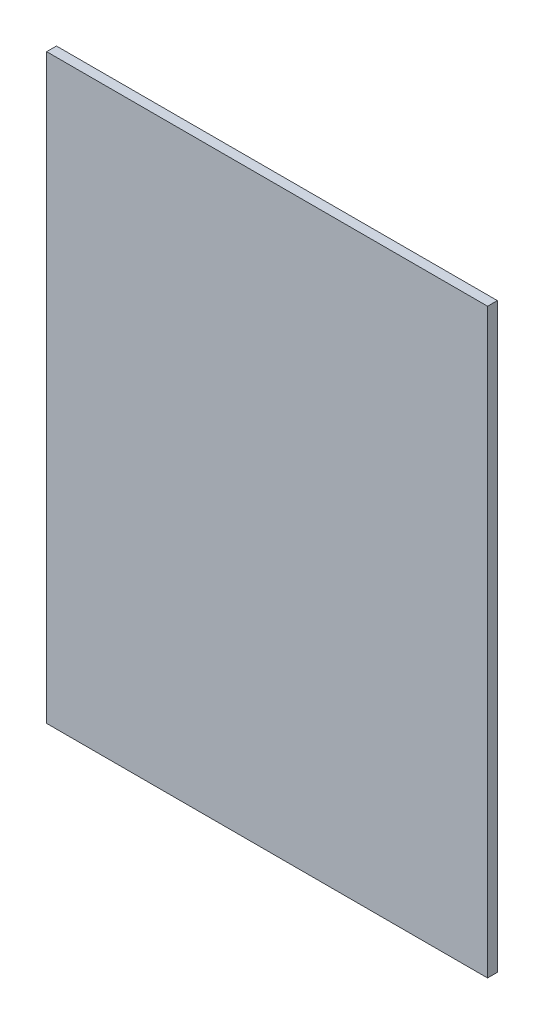
ISO-10303-21;
HEADER;
FILE_DESCRIPTION(('STEP AP214'),'2;1');
FILE_NAME('part.step','',(''),(''),'','','');
FILE_SCHEMA(('AUTOMOTIVE_DESIGN { 1 0 10303 214 1 1 1 1 }'));
ENDSEC;
DATA;
#1=APPLICATION_CONTEXT('core data for automotive mechanical design processes');
#2=APPLICATION_PROTOCOL_DEFINITION('international standard','automotive_design',2000,#1);
#3=PRODUCT_CONTEXT('',#1,'mechanical');
#4=PRODUCT('Part','Part','',(#3));
#5=PRODUCT_RELATED_PRODUCT_CATEGORY('part','',(#4));
#6=PRODUCT_DEFINITION_FORMATION('','',#4);
#7=PRODUCT_DEFINITION_CONTEXT('part definition',#1,'design');
#8=PRODUCT_DEFINITION('design','',#6,#7);
#9=PRODUCT_DEFINITION_SHAPE('','',#8);
#10=(LENGTH_UNIT() NAMED_UNIT(*) SI_UNIT(.MILLI.,.METRE.));
#11=(NAMED_UNIT(*) PLANE_ANGLE_UNIT() SI_UNIT($,.RADIAN.));
#12=(NAMED_UNIT(*) SI_UNIT($,.STERADIAN.) SOLID_ANGLE_UNIT());
#13=UNCERTAINTY_MEASURE_WITH_UNIT(LENGTH_MEASURE(1.E-05),#10,'distance_accuracy_value','');
#14=(GEOMETRIC_REPRESENTATION_CONTEXT(3) GLOBAL_UNCERTAINTY_ASSIGNED_CONTEXT((#13)) GLOBAL_UNIT_ASSIGNED_CONTEXT((#10,
#11,#12)) REPRESENTATION_CONTEXT('',''));
#15=CARTESIAN_POINT('',(0.,0.,0.));
#16=DIRECTION('',(0.,0.,1.));
#17=DIRECTION('',(1.,0.,0.));
#18=AXIS2_PLACEMENT_3D('',#15,#16,#17);
#19=CARTESIAN_POINT('',(-73.8944174376666,61.9928571428572,1.6));
#20=DIRECTION('',(1.,0.,0.));
#21=DIRECTION('',(0.,1.,0.));
#22=AXIS2_PLACEMENT_3D('',#19,#20,#21);
#23=PLANE('',#22);
#24=DIRECTION('',(0.,-1.,0.));
#25=VECTOR('',#24,1.);
#26=CARTESIAN_POINT('',(-73.8944174376666,61.9928571428572,0.));
#27=LINE('',#26,#25);
#28=CARTESIAN_POINT('',(-73.8944174376666,61.9928571428572,0.));
#29=VERTEX_POINT('',#28);
#30=CARTESIAN_POINT('',(-73.8944174376666,-33.0071428571428,0.));
#31=VERTEX_POINT('',#30);
#32=EDGE_CURVE('E96',#29,#31,#27,.T.);
#33=ORIENTED_EDGE('',*,*,#32,.T.);
#34=DIRECTION('',(0.,0.,-1.));
#35=VECTOR('',#34,1.);
#36=CARTESIAN_POINT('',(-73.8944174376666,-33.0071428571428,1.6));
#37=LINE('',#36,#35);
#38=CARTESIAN_POINT('',(-73.8944174376666,-33.0071428571428,1.6));
#39=VERTEX_POINT('',#38);
#40=EDGE_CURVE('E11',#39,#31,#37,.T.);
#41=ORIENTED_EDGE('',*,*,#40,.F.);
#42=DIRECTION('',(0.,-1.,0.));
#43=VECTOR('',#42,1.);
#44=CARTESIAN_POINT('',(-73.8944174376666,61.9928571428572,1.6));
#45=LINE('',#44,#43);
#46=CARTESIAN_POINT('',(-73.8944174376666,61.9928571428572,1.6));
#47=VERTEX_POINT('',#46);
#48=EDGE_CURVE('E84',#47,#39,#45,.T.);
#49=ORIENTED_EDGE('',*,*,#48,.F.);
#50=DIRECTION('',(0.,0.,-1.));
#51=VECTOR('',#50,1.);
#52=CARTESIAN_POINT('',(-73.8944174376666,61.9928571428572,1.6));
#53=LINE('',#52,#51);
#54=EDGE_CURVE('E92',#47,#29,#53,.T.);
#55=ORIENTED_EDGE('',*,*,#54,.T.);
#56=EDGE_LOOP('',(#33,#41,#49,#55));
#57=FACE_BOUND('',#56,.T.);
#58=ADVANCED_FACE('F33',(#57),#23,.F.);
#59=CARTESIAN_POINT('',(-73.8944174376666,-33.0071428571428,1.6));
#60=DIRECTION('',(0.,1.,0.));
#61=DIRECTION('',(0.,0.,1.));
#62=AXIS2_PLACEMENT_3D('',#59,#60,#61);
#63=PLANE('',#62);
#64=DIRECTION('',(1.,0.,0.));
#65=VECTOR('',#64,1.);
#66=CARTESIAN_POINT('',(-73.8944174376666,-33.0071428571428,0.));
#67=LINE('',#66,#65);
#68=CARTESIAN_POINT('',(-1.89441743766658,-33.0071428571428,0.));
#69=VERTEX_POINT('',#68);
#70=EDGE_CURVE('E88',#31,#69,#67,.T.);
#71=ORIENTED_EDGE('',*,*,#70,.T.);
#72=DIRECTION('',(0.,0.,-1.));
#73=VECTOR('',#72,1.);
#74=CARTESIAN_POINT('',(-1.89441743766658,-33.0071428571428,1.6));
#75=LINE('',#74,#73);
#76=CARTESIAN_POINT('',(-1.89441743766658,-33.0071428571428,1.6));
#77=VERTEX_POINT('',#76);
#78=EDGE_CURVE('E41',#77,#69,#75,.T.);
#79=ORIENTED_EDGE('',*,*,#78,.F.);
#80=DIRECTION('',(1.,0.,0.));
#81=VECTOR('',#80,1.);
#82=CARTESIAN_POINT('',(-73.8944174376666,-33.0071428571428,1.6));
#83=LINE('',#82,#81);
#84=EDGE_CURVE('E79',#39,#77,#83,.T.);
#85=ORIENTED_EDGE('',*,*,#84,.F.);
#86=ORIENTED_EDGE('',*,*,#40,.T.);
#87=EDGE_LOOP('',(#71,#79,#85,#86));
#88=FACE_BOUND('',#87,.T.);
#89=ADVANCED_FACE('F87',(#88),#63,.F.);
#90=CARTESIAN_POINT('',(-1.89441743766659,61.9928571428572,1.6));
#91=DIRECTION('',(-1.,0.,0.));
#92=DIRECTION('',(0.,-1.,0.));
#93=AXIS2_PLACEMENT_3D('',#90,#91,#92);
#94=PLANE('',#93);
#95=DIRECTION('',(0.,1.,0.));
#96=VECTOR('',#95,1.);
#97=CARTESIAN_POINT('',(-1.89441743766659,61.9928571428572,0.));
#98=LINE('',#97,#96);
#99=CARTESIAN_POINT('',(-1.89441743766659,61.9928571428572,0.));
#100=VERTEX_POINT('',#99);
#101=EDGE_CURVE('E66',#69,#100,#98,.T.);
#102=ORIENTED_EDGE('',*,*,#101,.T.);
#103=DIRECTION('',(0.,0.,-1.));
#104=VECTOR('',#103,1.);
#105=CARTESIAN_POINT('',(-1.89441743766659,61.9928571428572,1.6));
#106=LINE('',#105,#104);
#107=CARTESIAN_POINT('',(-1.89441743766659,61.9928571428572,1.6));
#108=VERTEX_POINT('',#107);
#109=EDGE_CURVE('E89',#108,#100,#106,.T.);
#110=ORIENTED_EDGE('',*,*,#109,.F.);
#111=DIRECTION('',(0.,1.,0.));
#112=VECTOR('',#111,1.);
#113=CARTESIAN_POINT('',(-1.89441743766659,61.9928571428572,1.6));
#114=LINE('',#113,#112);
#115=EDGE_CURVE('E82',#77,#108,#114,.T.);
#116=ORIENTED_EDGE('',*,*,#115,.F.);
#117=ORIENTED_EDGE('',*,*,#78,.T.);
#118=EDGE_LOOP('',(#102,#110,#116,#117));
#119=FACE_BOUND('',#118,.T.);
#120=ADVANCED_FACE('F90',(#119),#94,.F.);
#121=CARTESIAN_POINT('',(-73.8944174376666,61.9928571428572,1.6));
#122=DIRECTION('',(0.,-1.,0.));
#123=DIRECTION('',(0.,0.,-1.));
#124=AXIS2_PLACEMENT_3D('',#121,#122,#123);
#125=PLANE('',#124);
#126=DIRECTION('',(-1.,0.,0.));
#127=VECTOR('',#126,1.);
#128=CARTESIAN_POINT('',(-73.8944174376666,61.9928571428572,0.));
#129=LINE('',#128,#127);
#130=EDGE_CURVE('E72',#100,#29,#129,.T.);
#131=ORIENTED_EDGE('',*,*,#130,.T.);
#132=ORIENTED_EDGE('',*,*,#54,.F.);
#133=DIRECTION('',(-1.,0.,0.));
#134=VECTOR('',#133,1.);
#135=CARTESIAN_POINT('',(-73.8944174376666,61.9928571428572,1.6));
#136=LINE('',#135,#134);
#137=EDGE_CURVE('E49',#108,#47,#136,.T.);
#138=ORIENTED_EDGE('',*,*,#137,.F.);
#139=ORIENTED_EDGE('',*,*,#109,.T.);
#140=EDGE_LOOP('',(#131,#132,#138,#139));
#141=FACE_BOUND('',#140,.T.);
#142=ADVANCED_FACE('F103',(#141),#125,.F.);
#143=CARTESIAN_POINT('',(0.,0.,1.6));
#144=DIRECTION('',(0.,0.,1.));
#145=DIRECTION('',(1.,0.,0.));
#146=AXIS2_PLACEMENT_3D('',#143,#144,#145);
#147=PLANE('',#146);
#148=ORIENTED_EDGE('',*,*,#48,.T.);
#149=ORIENTED_EDGE('',*,*,#84,.T.);
#150=ORIENTED_EDGE('',*,*,#115,.T.);
#151=ORIENTED_EDGE('',*,*,#137,.T.);
#152=EDGE_LOOP('',(#148,#149,#150,#151));
#153=FACE_BOUND('',#152,.T.);
#154=ADVANCED_FACE('F80',(#153),#147,.T.);
#155=CARTESIAN_POINT('',(0.,0.,0.));
#156=DIRECTION('',(0.,0.,1.));
#157=DIRECTION('',(1.,0.,0.));
#158=AXIS2_PLACEMENT_3D('',#155,#156,#157);
#159=PLANE('',#158);
#160=ORIENTED_EDGE('',*,*,#32,.F.);
#161=ORIENTED_EDGE('',*,*,#130,.F.);
#162=ORIENTED_EDGE('',*,*,#101,.F.);
#163=ORIENTED_EDGE('',*,*,#70,.F.);
#164=EDGE_LOOP('',(#160,#161,#162,#163));
#165=FACE_BOUND('',#164,.T.);
#166=ADVANCED_FACE('F106',(#165),#159,.F.);
#167=CLOSED_SHELL('',(#58,#89,#120,#142,#154,#166));
#168=MANIFOLD_SOLID_BREP('B2',#167);
#169=ADVANCED_BREP_SHAPE_REPRESENTATION('',(#18,#168),#14);
#170=SHAPE_DEFINITION_REPRESENTATION(#9,#169);
ENDSEC;
END-ISO-10303-21;
